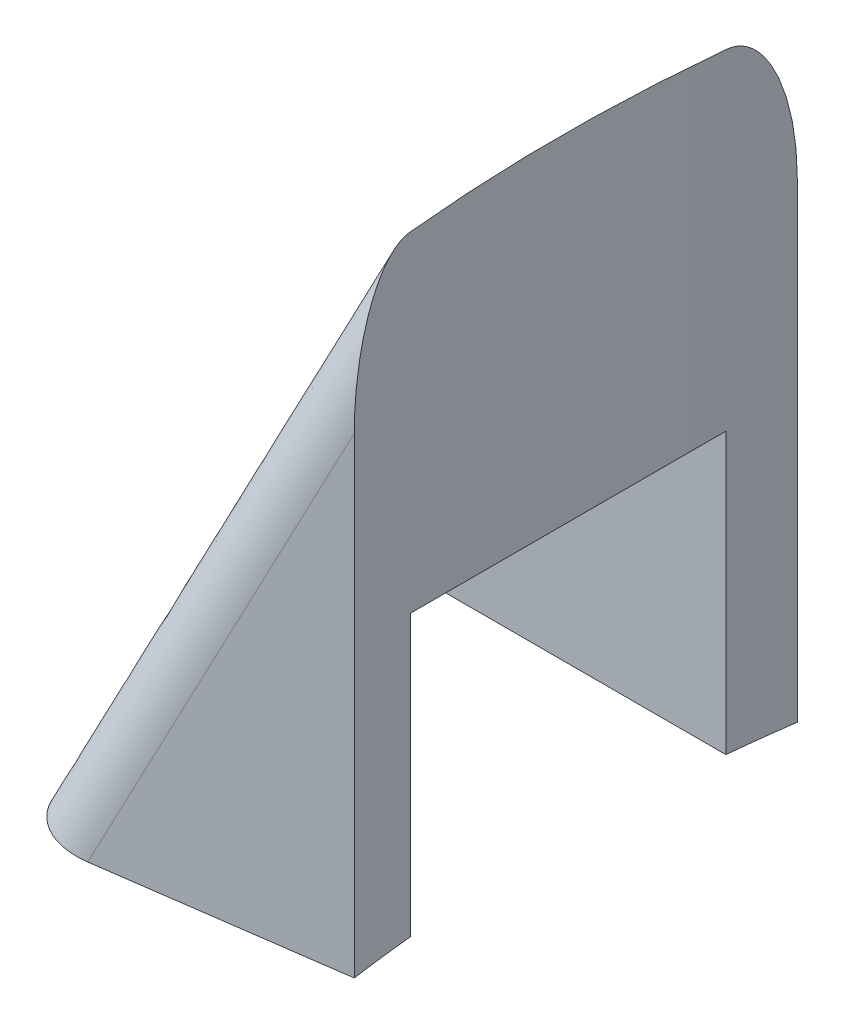
ISO-10303-21;
HEADER;
FILE_DESCRIPTION(('STEP AP214'),'2;1');
FILE_NAME('part.step','',(''),(''),'','','');
FILE_SCHEMA(('AUTOMOTIVE_DESIGN { 1 0 10303 214 1 1 1 1 }'));
ENDSEC;
DATA;
#1=APPLICATION_CONTEXT('core data for automotive mechanical design processes');
#2=APPLICATION_PROTOCOL_DEFINITION('international standard','automotive_design',2000,#1);
#3=PRODUCT_CONTEXT('',#1,'mechanical');
#4=PRODUCT('Part','Part','',(#3));
#5=PRODUCT_RELATED_PRODUCT_CATEGORY('part','',(#4));
#6=PRODUCT_DEFINITION_FORMATION('','',#4);
#7=PRODUCT_DEFINITION_CONTEXT('part definition',#1,'design');
#8=PRODUCT_DEFINITION('design','',#6,#7);
#9=PRODUCT_DEFINITION_SHAPE('','',#8);
#10=(LENGTH_UNIT() NAMED_UNIT(*) SI_UNIT(.MILLI.,.METRE.));
#11=(NAMED_UNIT(*) PLANE_ANGLE_UNIT() SI_UNIT($,.RADIAN.));
#12=(NAMED_UNIT(*) SI_UNIT($,.STERADIAN.) SOLID_ANGLE_UNIT());
#13=UNCERTAINTY_MEASURE_WITH_UNIT(LENGTH_MEASURE(1.E-05),#10,'distance_accuracy_value','');
#14=(GEOMETRIC_REPRESENTATION_CONTEXT(3) GLOBAL_UNCERTAINTY_ASSIGNED_CONTEXT((#13)) GLOBAL_UNIT_ASSIGNED_CONTEXT((#10,
#11,#12)) REPRESENTATION_CONTEXT('',''));
#15=CARTESIAN_POINT('',(0.,0.,0.));
#16=DIRECTION('',(0.,0.,1.));
#17=DIRECTION('',(1.,0.,0.));
#18=AXIS2_PLACEMENT_3D('',#15,#16,#17);
#19=CARTESIAN_POINT('',(0.,60.,0.));
#20=DIRECTION('',(0.,-1.,0.));
#21=DIRECTION('',(1.,0.,0.));
#22=AXIS2_PLACEMENT_3D('',#19,#20,#21);
#23=CONICAL_SURFACE('',#22,156.4,0.463647609000806);
#24=CARTESIAN_POINT('',(0.,0.,0.));
#25=DIRECTION('',(0.,1.,0.));
#26=DIRECTION('',(-1.,0.,0.));
#27=AXIS2_PLACEMENT_3D('',#24,#25,#26);
#28=CIRCLE('',#27,186.4);
#29=CARTESIAN_POINT('',(-185.344352378837,0.,-19.8098723183533));
#30=VERTEX_POINT('',#29);
#31=CARTESIAN_POINT('',(-185.344352378837,0.,19.8098723183533));
#32=VERTEX_POINT('',#31);
#33=EDGE_CURVE('E153',#30,#32,#28,.T.);
#34=ORIENTED_EDGE('',*,*,#33,.T.);
#35=CARTESIAN_POINT('',(-114.632364498512,142.70661885757,9.755102299269));
#36=CARTESIAN_POINT('',(-114.029462463013,142.844664183693,16.0257958352169));
#37=CARTESIAN_POINT('',(-108.450089743653,140.02333728457,15.2416661361223));
#38=CARTESIAN_POINT('',(-119.289973700437,133.311716535217,10.422318340286));
#39=CARTESIAN_POINT('',(-118.67216197689,133.452606155784,16.6782847001696));
#40=CARTESIAN_POINT('',(-113.108765563172,130.628434962212,15.8964003244053));
#41=CARTESIAN_POINT('',(-123.947015799257,123.916481438908,11.0879595435853));
#42=CARTESIAN_POINT('',(-123.320677938584,124.050689790255,17.3315910135534));
#43=CARTESIAN_POINT('',(-117.76678319679,121.233199865905,16.5510420106924));
#44=CARTESIAN_POINT('',(-133.260239153114,105.125499700327,12.4168210809062));
#45=CARTESIAN_POINT('',(-132.617238925096,105.250718088857,18.6381374544596));
#46=CARTESIAN_POINT('',(-127.081806428787,102.442218127331,17.8601831509896));
#47=CARTESIAN_POINT('',(-137.916420408156,95.7297530580564,13.0800414149388));
#48=CARTESIAN_POINT('',(-137.267147589753,95.8488890033988,19.2916394994803));
#49=CARTESIAN_POINT('',(-131.738812027172,93.0464714850653,18.5146826050002));
#50=CARTESIAN_POINT('',(-147.228195430667,76.9379022420714,14.4047900190291));
#51=CARTESIAN_POINT('',(-146.566047606283,77.0490900928585,20.5985146696175));
#52=CARTESIAN_POINT('',(-141.052115519051,74.2546206690796,19.8235820515856));
#53=CARTESIAN_POINT('',(-151.883789198143,67.5417980683605,15.0663182891046));
#54=CARTESIAN_POINT('',(-151.216336014646,67.6484952175082,21.2520700841357));
#55=CARTESIAN_POINT('',(-145.708413412553,64.858516495363,20.4779820441613));
#56=CARTESIAN_POINT('',(-161.194536582301,48.7493180066242,16.3880895618103));
#57=CARTESIAN_POINT('',(-160.516464275944,48.8497202407779,22.5591178728179));
#58=CARTESIAN_POINT('',(-155.020471506104,46.0660364336222,21.7867064614262));
#59=CARTESIAN_POINT('',(-165.849690198982,39.3529421185984,17.0483325644388));
#60=CARTESIAN_POINT('',(-165.16728575477,39.4495542289894,23.2127482055038));
#61=CARTESIAN_POINT('',(-159.676231706153,36.6696605455977,22.4410308861153));
#62=CARTESIAN_POINT('',(-179.81466098894,11.163507501734,19.0276089509326));
#63=CARTESIAN_POINT('',(-179.112316572631,11.2657691925325,25.1725944765966));
#64=CARTESIAN_POINT('',(-173.642904284834,8.48022592873613,24.4039187083381));
#65=CARTESIAN_POINT('',(-189.123988199008,-7.62985837541306,20.3451897271753));
#66=CARTESIAN_POINT('',(-188.416694976641,-7.53671907366697,26.4802395838831));
#67=CARTESIAN_POINT('',(-182.953208738894,-10.3131399484106,25.7123966676451));
#68=CARTESIAN_POINT('',(-203.087383332494,-35.8202892279976,22.3197552836382));
#69=CARTESIAN_POINT('',(-202.37545791575,-35.7428144251435,28.4420157787582));
#70=CARTESIAN_POINT('',(-196.917909359765,-38.5035708009963,27.6750073492714));
#71=CARTESIAN_POINT('',(-207.741749121565,-45.2171632351673,22.9776428713161));
#72=CARTESIAN_POINT('',(-207.027033121767,-45.141782060839,29.0957520408928));
#73=CARTESIAN_POINT('',(-201.572683581533,-47.9004448081666,28.3291932037497));
#74=CARTESIAN_POINT('',(-217.050316237132,-64.011017343805,24.2929165317831));
#75=CARTESIAN_POINT('',(-216.330064415228,-63.9389039246394,30.4032078241383));
#76=CARTESIAN_POINT('',(-210.882021972676,-66.6942989168052,29.637535391768));
#77=CARTESIAN_POINT('',(-221.704517563628,-73.4079974452729,24.9503026045726));
#78=CARTESIAN_POINT('',(-220.981899853559,-73.3378249866923,31.0569806595395));
#79=CARTESIAN_POINT('',(-215.536586142052,-76.0912790182733,30.291691725308));
#80=CARTESIAN_POINT('',(-226.358653719376,-82.8050199915564,25.6074880987639));
#81=CARTESIAN_POINT('',(-225.634806163326,-82.7386817555772,31.7109039961063));
#82=CARTESIAN_POINT('',(-220.191066280633,-85.4883015645561,30.9458362490898));
#83=(BOUNDED_SURFACE() B_SPLINE_SURFACE(3,2,((#35,#36,#37),(#38,#39,#40),(#41,#42,#43),(#44,#45,
#46),(#47,#48,#49),(#50,#51,#52),(#53,#54,#55),(#56,#57,#58),(#59,#60,#61),(#62,#63,#64),(#65,
#66,#67),(#68,#69,#70),(#71,#72,#73),(#74,#75,#76),(#77,#78,#79),(#80,#81,#82)),.UNSPECIFIED.,
.F.,.F.,.F.) B_SPLINE_SURFACE_WITH_KNOTS((4,2,2,2,2,2,2,4),(3,3),(0.,31.520868269444,
63.0417363941229,94.5626041871236,126.083472021928,189.125207035624,220.646074879006,
252.166942700222),(0.,1.),
.UNSPECIFIED.) GEOMETRIC_REPRESENTATION_ITEM() RATIONAL_B_SPLINE_SURFACE(((1.,0.689590740743566,
1.),(1.,0.690346426131703,1.),(1.,0.691011665635995,1.),(1.,0.692203336575749,1.),(1.,
0.692729768011848,1.),(1.,0.693685906515217,1.),(1.,0.694115613583504,1.),(1.,0.694901681346329,
1.),(1.,0.69525804204077,1.),(1.,0.696244382040556,1.),(1.,0.696791619271503,1.),(1.,
0.697509896745316,1.),(1.,0.697732226175399,1.),(1.,0.698148413972608,1.),(1.,0.698342272339754,
1.),(1.,0.69852475604033,1.))) REPRESENTATION_ITEM('') SURFACE());
#84=CARTESIAN_POINT('',(-226.358653719376,-82.8050199915564,25.6074880987639));
#85=CARTESIAN_POINT('',(-221.704517563628,-73.407997445273,24.9503026045726));
#86=CARTESIAN_POINT('',(-217.050316237132,-64.011017343805,24.2929165317831));
#87=CARTESIAN_POINT('',(-207.741749121565,-45.2171632351673,22.9776428713161));
#88=CARTESIAN_POINT('',(-203.087383332494,-35.8202892279976,22.3197552836382));
#89=CARTESIAN_POINT('',(-189.123988199008,-7.62985837541308,20.3451897271753));
#90=CARTESIAN_POINT('',(-179.81466098894,11.163507501734,19.0276089509326));
#91=CARTESIAN_POINT('',(-165.849690198982,39.3529421185984,17.0483325644388));
#92=CARTESIAN_POINT('',(-161.194536582301,48.7493180066242,16.3880895618103));
#93=CARTESIAN_POINT('',(-151.883789198143,67.5417980683605,15.0663182891046));
#94=CARTESIAN_POINT('',(-147.228195430667,76.9379022420714,14.4047900190291));
#95=CARTESIAN_POINT('',(-137.916420408156,95.7297530580564,13.0800414149388));
#96=CARTESIAN_POINT('',(-133.260239153114,105.125499700327,12.4168210809062));
#97=CARTESIAN_POINT('',(-123.947015799257,123.916481438908,11.0879595435853));
#98=CARTESIAN_POINT('',(-119.289973700437,133.311716535217,10.422318340286));
#99=CARTESIAN_POINT('',(-114.632364498512,142.70661885757,9.755102299269));
#100=B_SPLINE_CURVE_WITH_KNOTS('',3,(#84,#85,#86,#87,#88,#89,#90,#91,#92,#93,#94,#95,#96,#97,
#98,#99),.UNSPECIFIED.,.F.,.F.,(4,2,2,2,2,2,2,4),(0.,31.5208678212157,63.0417356645981,
126.083470678294,157.604338513098,189.125206306099,220.646074430778,252.166942700222),.UNSPECIFIED.);
#101=CARTESIAN_POINT('',(-155.620374576695,60.,15.5967630170207));
#102=VERTEX_POINT('',#101);
#103=EDGE_CURVE('E65',#32,#102,#100,.T.);
#104=ORIENTED_EDGE('',*,*,#103,.T.);
#105=CARTESIAN_POINT('',(0.,60.,0.));
#106=DIRECTION('',(0.,1.,0.));
#107=DIRECTION('',(-1.,0.,0.));
#108=AXIS2_PLACEMENT_3D('',#105,#106,#107);
#109=CIRCLE('',#108,156.4);
#110=CARTESIAN_POINT('',(-155.620374576695,60.,-15.5967630170207));
#111=VERTEX_POINT('',#110);
#112=EDGE_CURVE('E149',#111,#102,#109,.T.);
#113=ORIENTED_EDGE('',*,*,#112,.F.);
#114=CARTESIAN_POINT('',(-226.358653719376,-82.8050199915564,-25.6074880987639));
#115=CARTESIAN_POINT('',(-225.634806163326,-82.7386817555772,-31.7109039961063));
#116=CARTESIAN_POINT('',(-220.191066280633,-85.4883015645561,-30.9458362490898));
#117=CARTESIAN_POINT('',(-221.704517563628,-73.407997445273,-24.9503026045726));
#118=CARTESIAN_POINT('',(-220.981899853559,-73.3378249866922,-31.0569806595395));
#119=CARTESIAN_POINT('',(-215.536586142052,-76.0912790182733,-30.291691725308));
#120=CARTESIAN_POINT('',(-217.050316237132,-64.011017343805,-24.2929165317831));
#121=CARTESIAN_POINT('',(-216.330064415228,-63.9389039246394,-30.4032078241383));
#122=CARTESIAN_POINT('',(-210.882021972676,-66.6942989168052,-29.637535391768));
#123=CARTESIAN_POINT('',(-207.741749121565,-45.2171632351673,-22.9776428713161));
#124=CARTESIAN_POINT('',(-207.027033121767,-45.141782060839,-29.0957520408928));
#125=CARTESIAN_POINT('',(-201.572683581533,-47.9004448081666,-28.3291932037497));
#126=CARTESIAN_POINT('',(-203.087383332494,-35.8202892279976,-22.3197552836382));
#127=CARTESIAN_POINT('',(-202.37545791575,-35.7428144251435,-28.4420157787582));
#128=CARTESIAN_POINT('',(-196.917909359765,-38.5035708009963,-27.6750073492714));
#129=CARTESIAN_POINT('',(-189.123988199008,-7.62985837541308,-20.3451897271753));
#130=CARTESIAN_POINT('',(-188.416694976641,-7.53671907366698,-26.4802395838831));
#131=CARTESIAN_POINT('',(-182.953208738894,-10.3131399484106,-25.7123966676451));
#132=CARTESIAN_POINT('',(-179.81466098894,11.163507501734,-19.0276089509326));
#133=CARTESIAN_POINT('',(-179.112316572631,11.2657691925325,-25.1725944765966));
#134=CARTESIAN_POINT('',(-173.642904284834,8.48022592873613,-24.4039187083381));
#135=CARTESIAN_POINT('',(-165.849690198982,39.3529421185984,-17.0483325644388));
#136=CARTESIAN_POINT('',(-165.16728575477,39.4495542289894,-23.2127482055038));
#137=CARTESIAN_POINT('',(-159.676231706153,36.6696605455977,-22.4410308861153));
#138=CARTESIAN_POINT('',(-161.194536582301,48.7493180066242,-16.3880895618103));
#139=CARTESIAN_POINT('',(-160.516464275944,48.8497202407779,-22.5591178728179));
#140=CARTESIAN_POINT('',(-155.020471506104,46.0660364336222,-21.7867064614262));
#141=CARTESIAN_POINT('',(-151.883789198143,67.5417980683605,-15.0663182891046));
#142=CARTESIAN_POINT('',(-151.216336014646,67.6484952175082,-21.2520700841357));
#143=CARTESIAN_POINT('',(-145.708413412553,64.858516495363,-20.4779820441613));
#144=CARTESIAN_POINT('',(-147.228195430667,76.9379022420714,-14.4047900190291));
#145=CARTESIAN_POINT('',(-146.566047606283,77.0490900928585,-20.5985146696175));
#146=CARTESIAN_POINT('',(-141.052115519051,74.2546206690796,-19.8235820515856));
#147=CARTESIAN_POINT('',(-137.916420408156,95.7297530580564,-13.0800414149389));
#148=CARTESIAN_POINT('',(-137.267147589753,95.8488890033988,-19.2916394994803));
#149=CARTESIAN_POINT('',(-131.738812027172,93.0464714850653,-18.5146826050002));
#150=CARTESIAN_POINT('',(-133.260239153114,105.125499700327,-12.4168210809062));
#151=CARTESIAN_POINT('',(-132.617238925096,105.250718088857,-18.6381374544596));
#152=CARTESIAN_POINT('',(-127.081806428788,102.442218127331,-17.8601831509896));
#153=CARTESIAN_POINT('',(-123.947015799257,123.916481438908,-11.0879595435854));
#154=CARTESIAN_POINT('',(-123.320677938584,124.050689790255,-17.3315910135534));
#155=CARTESIAN_POINT('',(-117.76678319679,121.233199865905,-16.5510420106924));
#156=CARTESIAN_POINT('',(-119.289973700437,133.311716535217,-10.422318340286));
#157=CARTESIAN_POINT('',(-118.67216197689,133.452606155784,-16.6782847001696));
#158=CARTESIAN_POINT('',(-113.108765563172,130.628434962212,-15.8964003244053));
#159=CARTESIAN_POINT('',(-114.632364498512,142.70661885757,-9.755102299269));
#160=CARTESIAN_POINT('',(-114.029462463013,142.844664183693,-16.0257958352169));
#161=CARTESIAN_POINT('',(-108.450089743653,140.02333728457,-15.2416661361223));
#162=(BOUNDED_SURFACE() B_SPLINE_SURFACE(3,2,((#114,#115,#116),(#117,#118,#119),(#120,#121,
#122),(#123,#124,#125),(#126,#127,#128),(#129,#130,#131),(#132,#133,#134),(#135,#136,#137),
(#138,#139,#140),(#141,#142,#143),(#144,#145,#146),(#147,#148,#149),(#150,#151,#152),(#153,#154,
#155),(#156,#157,#158),(#159,#160,#161)),.UNSPECIFIED.,.F.,.F.,
.F.) B_SPLINE_SURFACE_WITH_KNOTS((4,2,2,2,2,2,2,4),(3,3),(0.,31.5208678212157,63.0417356645982,
126.083470678294,157.604338513098,189.125206306099,220.646074430778,252.166942700222),(0.,1.),
.UNSPECIFIED.) GEOMETRIC_REPRESENTATION_ITEM() RATIONAL_B_SPLINE_SURFACE(((1.,0.69852475604033,
1.),(1.,0.698342272339754,1.),(1.,0.698148413972608,1.),(1.,0.697732226175399,1.),(1.,
0.697509896745316,1.),(1.,0.696791619271503,1.),(1.,0.696244382040555,1.),(1.,0.69525804204077,
1.),(1.,0.694901681346329,1.),(1.,0.694115613583505,1.),(1.,0.693685906515217,1.),(1.,
0.692729768011848,1.),(1.,0.692203336575749,1.),(1.,0.691011665635995,1.),(1.,0.690346426131703,
1.),(1.,0.689590740743566,1.))) REPRESENTATION_ITEM('') SURFACE());
#163=CARTESIAN_POINT('',(-114.632364498512,142.70661885757,-9.755102299269));
#164=CARTESIAN_POINT('',(-119.289973700437,133.311716535217,-10.422318340286));
#165=CARTESIAN_POINT('',(-123.947015799257,123.916481438908,-11.0879595435853));
#166=CARTESIAN_POINT('',(-133.260239153114,105.125499700327,-12.4168210809062));
#167=CARTESIAN_POINT('',(-137.916420408156,95.7297530580564,-13.0800414149389));
#168=CARTESIAN_POINT('',(-147.228195430667,76.9379022420714,-14.4047900190291));
#169=CARTESIAN_POINT('',(-151.883789198143,67.5417980683605,-15.0663182891046));
#170=CARTESIAN_POINT('',(-161.194536582301,48.7493180066242,-16.3880895618103));
#171=CARTESIAN_POINT('',(-165.849690198982,39.3529421185984,-17.0483325644388));
#172=CARTESIAN_POINT('',(-179.81466098894,11.163507501734,-19.0276089509326));
#173=CARTESIAN_POINT('',(-189.123988199008,-7.62985837541308,-20.3451897271753));
#174=CARTESIAN_POINT('',(-203.087383332494,-35.8202892279976,-22.3197552836382));
#175=CARTESIAN_POINT('',(-207.741749121565,-45.2171632351673,-22.9776428713161));
#176=CARTESIAN_POINT('',(-217.050316237132,-64.011017343805,-24.2929165317831));
#177=CARTESIAN_POINT('',(-221.704517563628,-73.407997445273,-24.9503026045726));
#178=CARTESIAN_POINT('',(-226.358653719376,-82.8050199915564,-25.6074880987639));
#179=B_SPLINE_CURVE_WITH_KNOTS('',3,(#163,#164,#165,#166,#167,#168,#169,#170,#171,#172,#173,
#174,#175,#176,#177,#178),.UNSPECIFIED.,.F.,.F.,(4,2,2,2,2,2,2,4),(0.,31.5208682694441,
63.0417363941229,94.5626041871236,126.083472021928,189.125207035624,220.646074879006,
252.166942700222),.UNSPECIFIED.);
#180=EDGE_CURVE('E238',#111,#30,#179,.T.);
#181=ORIENTED_EDGE('',*,*,#180,.T.);
#182=EDGE_LOOP('',(#34,#104,#113,#181));
#183=FACE_BOUND('',#182,.T.);
#184=ADVANCED_FACE('F38',(#183),#23,.T.);
#185=CARTESIAN_POINT('',(-184.585968013429,0.,-25.9418660189563));
#186=DIRECTION('',(0.,-1.,0.));
#187=DIRECTION('',(1.,0.,0.));
#188=AXIS2_PLACEMENT_3D('',#185,#186,#187);
#189=PLANE('',#188);
#190=DIRECTION('',(0.99026806874157,0.,-0.139173100960066));
#191=VECTOR('',#190,1.);
#192=CARTESIAN_POINT('',(-184.585968013429,0.,25.9418660189563));
#193=LINE('',#192,#191);
#194=CARTESIAN_POINT('',(-177.843823540054,0.,24.9943194069841));
#195=VERTEX_POINT('',#194);
#196=CARTESIAN_POINT('',(-154.877925951182,0.,21.7666729901543));
#197=VERTEX_POINT('',#196);
#198=EDGE_CURVE('E129',#195,#197,#193,.T.);
#199=ORIENTED_EDGE('',*,*,#198,.F.);
#200=CARTESIAN_POINT('',(-177.843823540054,0.,24.9943194069841));
#201=CARTESIAN_POINT('',(-178.048004830635,0.,25.0230211476792));
#202=CARTESIAN_POINT('',(-178.253376299629,0.,25.0432943394174));
#203=CARTESIAN_POINT('',(-178.665129441646,0.,25.0668274461386));
#204=CARTESIAN_POINT('',(-178.871511297604,0.,25.0700841568888));
#205=CARTESIAN_POINT('',(-179.284476257102,0.,25.0594006591258));
#206=CARTESIAN_POINT('',(-179.491058000942,0.,25.0454071050883));
#207=CARTESIAN_POINT('',(-179.902293174687,0.,25.0000135381139));
#208=CARTESIAN_POINT('',(-180.106946730846,0.,24.9686146730191));
#209=CARTESIAN_POINT('',(-180.513228735104,0.,24.8882576184924));
#210=CARTESIAN_POINT('',(-180.71485003327,0.,24.8392631661245));
#211=CARTESIAN_POINT('',(-181.112901546847,0.,24.7237406730884));
#212=CARTESIAN_POINT('',(-181.3093344922,0.,24.6572220637576));
#213=CARTESIAN_POINT('',(-181.695250390679,0.,24.5067835727408));
#214=CARTESIAN_POINT('',(-181.884738892325,0.,24.4228779562349));
#215=CARTESIAN_POINT('',(-182.2551110063,0.,24.2378328776925));
#216=CARTESIAN_POINT('',(-182.435995368946,0.,24.1366949219241));
#217=CARTESIAN_POINT('',(-182.776070354243,0.,23.9245435819603));
#218=CARTESIAN_POINT('',(-182.935908931559,0.,23.8145690387462));
#219=CARTESIAN_POINT('',(-183.244727003544,0.,23.5803105985852));
#220=CARTESIAN_POINT('',(-183.393707907603,0.,23.4560285642567));
#221=CARTESIAN_POINT('',(-183.679130691095,0.,23.1938376108741));
#222=CARTESIAN_POINT('',(-183.815574542791,0.,23.0559308423007));
#223=CARTESIAN_POINT('',(-184.074245477545,0.,22.767377693874));
#224=CARTESIAN_POINT('',(-184.196474831913,0.,22.6167333559976));
#225=CARTESIAN_POINT('',(-184.412352203905,0.,22.3213238956068));
#226=CARTESIAN_POINT('',(-184.507667401049,0.,22.1777749704651));
#227=CARTESIAN_POINT('',(-184.684712462078,0.,21.8825410932719));
#228=CARTESIAN_POINT('',(-184.766444411131,0.,21.7308573947284));
#229=CARTESIAN_POINT('',(-184.915250792555,0.,21.4207702317995));
#230=CARTESIAN_POINT('',(-184.982349398297,0.,21.2623783739077));
#231=CARTESIAN_POINT('',(-185.101217827414,0.,20.9400200926927));
#232=CARTESIAN_POINT('',(-185.152995788122,0.,20.7760566803987));
#233=CARTESIAN_POINT('',(-185.231496705762,0.,20.4786709108061));
#234=CARTESIAN_POINT('',(-185.261194283267,0.,20.34602575511));
#235=CARTESIAN_POINT('',(-185.310417488198,0.,20.0790651292093));
#236=CARTESIAN_POINT('',(-185.329958108948,0.,19.9447524224112));
#237=CARTESIAN_POINT('',(-185.344352378837,0.,19.8098723183533));
#238=B_SPLINE_CURVE_WITH_KNOTS('',3,(#200,#201,#202,#203,#204,#205,#206,#207,#208,#209,#210,
#211,#212,#213,#214,#215,#216,#217,#218,#219,#220,#221,#222,#223,#224,#225,#226,#227,#228,#229,
#230,#231,#232,#233,#234,#235,#236,#237),.UNSPECIFIED.,.F.,.F.,(4,2,2,2,2,2,2,2,2,2,2,2,2,2,2,2,
2,2,4),(0.,0.61840019377349,1.23691682917935,1.85735100185841,2.47774426312769,3.09942350665081,
3.72076884931174,4.34160641301427,4.96238973750488,5.5436458114506,6.12482630006056,
6.70591520327117,7.28691112731532,7.80314945216627,8.31930845583039,8.83460822749416,
9.3496338119771,9.75704350342265,10.1638500714817),.UNSPECIFIED.);
#239=EDGE_CURVE('E241',#195,#32,#238,.T.);
#240=ORIENTED_EDGE('',*,*,#239,.T.);
#241=ORIENTED_EDGE('',*,*,#33,.F.);
#242=CARTESIAN_POINT('',(-185.344352378837,0.,-19.8098723183533));
#243=CARTESIAN_POINT('',(-185.327889842889,0.,-19.9642089723793));
#244=CARTESIAN_POINT('',(-185.304675289326,0.,-20.1178167923397));
#245=CARTESIAN_POINT('',(-185.245058491854,0.,-20.4224152337068));
#246=CARTESIAN_POINT('',(-185.208659362755,0.,-20.5734064644525));
#247=CARTESIAN_POINT('',(-185.123126355587,0.,-20.8711825022602));
#248=CARTESIAN_POINT('',(-185.074035896619,0.,-21.0179797921856));
#249=CARTESIAN_POINT('',(-184.96353992391,0.,-21.3068629207485));
#250=CARTESIAN_POINT('',(-184.902134134332,0.,-21.4489486537745));
#251=CARTESIAN_POINT('',(-184.767661703432,0.,-21.7273688272922));
#252=CARTESIAN_POINT('',(-184.694602775163,0.,-21.8637069970737));
#253=CARTESIAN_POINT('',(-184.537450954323,0.,-22.129929319818));
#254=CARTESIAN_POINT('',(-184.453353962392,0.,-22.2598110501321));
#255=CARTESIAN_POINT('',(-184.274911993502,0.,-22.5123521463636));
#256=CARTESIAN_POINT('',(-184.180565590691,0.,-22.6350105037275));
#257=CARTESIAN_POINT('',(-183.982415644084,0.,-22.8724999175942));
#258=CARTESIAN_POINT('',(-183.878608494141,0.,-22.9873279600182));
#259=CARTESIAN_POINT('',(-183.658343765606,0.,-23.2127696125563));
#260=CARTESIAN_POINT('',(-183.541557116583,0.,-23.3230619620934));
#261=CARTESIAN_POINT('',(-183.299689419542,0.,-23.5341716745124));
#262=CARTESIAN_POINT('',(-183.174605380594,0.,-23.6349855887326));
#263=CARTESIAN_POINT('',(-182.788399327846,0.,-23.9225720114846));
#264=CARTESIAN_POINT('',(-182.516148865188,0.,-24.0946661273968));
#265=CARTESIAN_POINT('',(-181.922098871727,0.,-24.4122698141318));
#266=CARTESIAN_POINT('',(-181.598056901538,0.,-24.5535427841804));
#267=CARTESIAN_POINT('',(-180.93195331002,0.,-24.7855057969487));
#268=CARTESIAN_POINT('',(-180.589873064467,0.,-24.8761423932816));
#269=CARTESIAN_POINT('',(-180.045683191522,0.,-24.9784859898868));
#270=CARTESIAN_POINT('',(-179.846618980565,0.,-25.0073738948498));
#271=CARTESIAN_POINT('',(-179.4467194888,0.,-25.0487392104554));
#272=CARTESIAN_POINT('',(-179.245883904269,0.,-25.061213749522));
#273=CARTESIAN_POINT('',(-178.844150229944,0.,-25.0698337201253));
#274=CARTESIAN_POINT('',(-178.643252590912,0.,-25.0660011828808));
#275=CARTESIAN_POINT('',(-178.242470608515,0.,-25.0422107278912));
#276=CARTESIAN_POINT('',(-178.042585993872,0.,-25.0222573847588));
#277=CARTESIAN_POINT('',(-177.843823540054,0.,-24.9943194069841));
#278=B_SPLINE_CURVE_WITH_KNOTS('',3,(#242,#243,#244,#245,#246,#247,#248,#249,#250,#251,#252,
#253,#254,#255,#256,#257,#258,#259,#260,#261,#262,#263,#264,#265,#266,#267,#268,#269,#270,#271,
#272,#273,#274,#275,#276,#277),.UNSPECIFIED.,.F.,.F.,(4,2,2,2,2,2,2,2,2,2,2,2,2,2,2,2,2,4),(0.,
0.465477745722362,0.930845595625844,1.39464194297361,1.85844867949428,2.32194969292978,
2.78562333288852,3.24936155989201,3.7132772950132,4.19465281473751,4.67620280718212,
5.638565230154,6.69489615055107,7.75233992552453,8.3552053378604,8.95817620960063,
9.56033271327881,10.1623184025653),.UNSPECIFIED.);
#279=CARTESIAN_POINT('',(-177.843823540054,0.,-24.9943194069841));
#280=VERTEX_POINT('',#279);
#281=EDGE_CURVE('E170',#30,#280,#278,.T.);
#282=ORIENTED_EDGE('',*,*,#281,.T.);
#283=DIRECTION('',(0.99026806874157,0.,0.139173100960066));
#284=VECTOR('',#283,1.);
#285=CARTESIAN_POINT('',(-184.585968013429,0.,-25.9418660189563));
#286=LINE('',#285,#284);
#287=CARTESIAN_POINT('',(-154.877925951182,0.,-21.7666729901543));
#288=VERTEX_POINT('',#287);
#289=EDGE_CURVE('E145',#280,#288,#286,.T.);
#290=ORIENTED_EDGE('',*,*,#289,.T.);
#291=CARTESIAN_POINT('',(0.,0.,0.));
#292=DIRECTION('',(0.,1.,0.));
#293=DIRECTION('',(-1.,0.,0.));
#294=AXIS2_PLACEMENT_3D('',#291,#292,#293);
#295=CIRCLE('',#294,156.4);
#296=CARTESIAN_POINT('',(-155.630042086996,0.,-15.5));
#297=VERTEX_POINT('',#296);
#298=EDGE_CURVE('E136',#288,#297,#295,.T.);
#299=ORIENTED_EDGE('',*,*,#298,.T.);
#300=DIRECTION('',(1.,0.,0.));
#301=VECTOR('',#300,1.);
#302=CARTESIAN_POINT('',(-183.162197198644,0.,-15.5));
#303=LINE('',#302,#301);
#304=CARTESIAN_POINT('',(-183.162197198644,0.,-15.5));
#305=VERTEX_POINT('',#304);
#306=EDGE_CURVE('E114',#305,#297,#303,.T.);
#307=ORIENTED_EDGE('',*,*,#306,.F.);
#308=DIRECTION('',(0.,0.,-1.));
#309=VECTOR('',#308,1.);
#310=CARTESIAN_POINT('',(-183.162197198644,0.,15.5));
#311=LINE('',#310,#309);
#312=CARTESIAN_POINT('',(-183.162197198644,0.,15.5));
#313=VERTEX_POINT('',#312);
#314=EDGE_CURVE('E121',#313,#305,#311,.T.);
#315=ORIENTED_EDGE('',*,*,#314,.F.);
#316=DIRECTION('',(1.,0.,0.));
#317=VECTOR('',#316,1.);
#318=CARTESIAN_POINT('',(-183.162197198644,0.,15.5));
#319=LINE('',#318,#317);
#320=CARTESIAN_POINT('',(-155.630042086996,0.,15.5));
#321=VERTEX_POINT('',#320);
#322=EDGE_CURVE('E130',#313,#321,#319,.T.);
#323=ORIENTED_EDGE('',*,*,#322,.T.);
#324=EDGE_CURVE('E151',#321,#197,#295,.T.);
#325=ORIENTED_EDGE('',*,*,#324,.T.);
#326=EDGE_LOOP('',(#199,#240,#241,#282,#290,#299,#307,#315,#323,#325));
#327=FACE_BOUND('',#326,.T.);
#328=ADVANCED_FACE('F134',(#327),#189,.T.);
#329=CARTESIAN_POINT('',(0.,70.,0.));
#330=DIRECTION('',(0.,1.,0.));
#331=DIRECTION('',(-1.,0.,0.));
#332=AXIS2_PLACEMENT_3D('',#329,#330,#331);
#333=CYLINDRICAL_SURFACE('',#332,156.4);
#334=ORIENTED_EDGE('',*,*,#112,.T.);
#335=CARTESIAN_POINT('',(-155.620374576695,60.,15.5967630170207));
#336=CARTESIAN_POINT('',(-155.611803381851,60.0000359014625,15.6822919497781));
#337=CARTESIAN_POINT('',(-155.603162568262,59.996013756026,15.7677895187336));
#338=CARTESIAN_POINT('',(-155.58582481174,59.9801718913298,15.9379533928361));
#339=CARTESIAN_POINT('',(-155.577127947911,59.9683614643528,16.0226205667147));
#340=CARTESIAN_POINT('',(-155.559837372439,59.937433550299,16.1896257344289));
#341=CARTESIAN_POINT('',(-155.551243591868,59.9183990055505,16.2719791726052));
#342=CARTESIAN_POINT('',(-155.534122953613,59.8735244489435,16.4348201399802));
#343=CARTESIAN_POINT('',(-155.525596120448,59.847682053428,16.5153070048685));
#344=CARTESIAN_POINT('',(-155.495935331979,59.746186772358,16.7932687711813));
#345=CARTESIAN_POINT('',(-155.475100773947,59.6540163515423,16.9848932468285));
#346=CARTESIAN_POINT('',(-155.434633965732,59.4398102653601,17.3513390363153));
#347=CARTESIAN_POINT('',(-155.415008080541,59.3176310202614,17.526073766466));
#348=CARTESIAN_POINT('',(-155.381002942457,59.0785709813142,17.8247492986395));
#349=CARTESIAN_POINT('',(-155.366362857705,58.9655751996275,17.9518340684418));
#350=CARTESIAN_POINT('',(-155.337983277274,58.7288513278767,18.1957701795674));
#351=CARTESIAN_POINT('',(-155.324244359999,58.6051164611542,18.3126149643466));
#352=CARTESIAN_POINT('',(-155.297631478829,58.3492159791367,18.5369474532332));
#353=CARTESIAN_POINT('',(-155.284758325802,58.2170426802035,18.644426412493));
#354=CARTESIAN_POINT('',(-155.25983807709,57.946055603961,18.8508218860697));
#355=CARTESIAN_POINT('',(-155.247791303421,57.8072392734292,18.9497350664544));
#356=CARTESIAN_POINT('',(-155.224879714866,57.5291821997285,19.1364902867167));
#357=CARTESIAN_POINT('',(-155.213988520067,57.390119655984,19.2245958366507));
#358=CARTESIAN_POINT('',(-155.192890996738,57.1079418784427,19.3941709566492));
#359=CARTESIAN_POINT('',(-155.182684801027,56.964825866307,19.4756392404363));
#360=CARTESIAN_POINT('',(-155.153022124173,56.5302999601556,19.711034504963));
#361=CARTESIAN_POINT('',(-155.134533924126,56.2338650922257,19.8558516249973));
#362=CARTESIAN_POINT('',(-155.099788637162,55.630095751637,20.1254578149686));
#363=CARTESIAN_POINT('',(-155.083544408377,55.3227102113016,20.2501321035235));
#364=CARTESIAN_POINT('',(-155.053199589723,54.7011935794631,20.4811829055221));
#365=CARTESIAN_POINT('',(-155.0390982933,54.3870647504692,20.5875654515268));
#366=CARTESIAN_POINT('',(-155.012921304383,53.7549373001768,20.7837427668177));
#367=CARTESIAN_POINT('',(-155.000838130597,53.4369578797463,20.8735989316669));
#368=CARTESIAN_POINT('',(-154.978506355386,52.7971403044817,21.0387619188291));
#369=CARTESIAN_POINT('',(-154.968258087398,52.4753014596344,21.1140660969782));
#370=CARTESIAN_POINT('',(-154.949491233555,51.8283462992457,21.2513520624508));
#371=CARTESIAN_POINT('',(-154.940974797183,51.5032264301652,21.3133172995051));
#372=CARTESIAN_POINT('',(-154.925612922384,50.8508018574968,21.424696400713));
#373=CARTESIAN_POINT('',(-154.918767551586,50.5234970660337,21.4741097568838));
#374=CARTESIAN_POINT('',(-154.906864432776,49.8766578652491,21.5598043954371));
#375=CARTESIAN_POINT('',(-154.901761233332,49.5571683553278,21.5964202808299));
#376=CARTESIAN_POINT('',(-154.893041366224,48.9171128464312,21.6588716765505));
#377=CARTESIAN_POINT('',(-154.889424737135,48.5965468197391,21.6847069071323));
#378=CARTESIAN_POINT('',(-154.88366036984,47.9557158209712,21.7258418473637));
#379=CARTESIAN_POINT('',(-154.881508166804,47.6354529337854,21.7411735816816));
#380=CARTESIAN_POINT('',(-154.878641938726,46.99462429913,21.7615781326484));
#381=CARTESIAN_POINT('',(-154.877927774286,46.6740585840292,21.7666519436526));
#382=CARTESIAN_POINT('',(-154.877925951182,46.3534977351177,21.7666729901543));
#383=B_SPLINE_CURVE_WITH_KNOTS('',3,(#335,#336,#337,#338,#339,#340,#341,#342,#343,#344,#345,
#346,#347,#348,#349,#350,#351,#352,#353,#354,#355,#356,#357,#358,#359,#360,#361,#362,#363,#364,
#365,#366,#367,#368,#369,#370,#371,#372,#373,#374,#375,#376,#377,#378,#379,#380,#381,#382),
.UNSPECIFIED.,.F.,.F.,(4,2,2,2,2,2,2,2,2,2,2,2,2,2,2,2,2,2,2,2,2,2,2,4),(0.,0.257739175498217,
0.515171394631617,0.769733234103298,1.02438432294873,1.66149638451042,2.30171826386873,
2.81305354722184,3.32471387642079,3.83684693410886,4.34917843423715,4.84392017856704,
5.33875757505627,6.32898023508494,7.32466040325071,8.32001156665343,9.31158681841135,
10.3033420749546,11.2963208468494,12.2893397988276,13.2540119839375,14.2187091996476,
15.1804518496231,16.1421012682697),.UNSPECIFIED.);
#384=CARTESIAN_POINT('',(-154.877925951182,46.3534977351177,21.7666729901543));
#385=VERTEX_POINT('',#384);
#386=EDGE_CURVE('E51',#102,#385,#383,.T.);
#387=ORIENTED_EDGE('',*,*,#386,.T.);
#388=DIRECTION('',(0.,1.,0.));
#389=VECTOR('',#388,1.);
#390=CARTESIAN_POINT('',(-154.877925951182,0.,21.7666729901543));
#391=LINE('',#390,#389);
#392=EDGE_CURVE('E142',#197,#385,#391,.T.);
#393=ORIENTED_EDGE('',*,*,#392,.F.);
#394=ORIENTED_EDGE('',*,*,#324,.F.);
#395=DIRECTION('',(0.,1.,0.));
#396=VECTOR('',#395,1.);
#397=CARTESIAN_POINT('',(-155.630042086996,70.,15.5));
#398=LINE('',#397,#396);
#399=CARTESIAN_POINT('',(-155.630042086996,27.5321551116478,15.5));
#400=VERTEX_POINT('',#399);
#401=EDGE_CURVE('E159',#400,#321,#398,.F.);
#402=ORIENTED_EDGE('',*,*,#401,.F.);
#403=CARTESIAN_POINT('',(0.,183.162197198642,0.));
#404=DIRECTION('',(0.707106781186544,-0.707106781186551,0.));
#405=DIRECTION('',(0.707106781186551,0.707106781186544,0.));
#406=AXIS2_PLACEMENT_3D('',#403,#404,#405);
#407=ELLIPSE('',#406,221.183001155151,156.4);
#408=CARTESIAN_POINT('',(-155.630042086996,27.5321551116478,-15.5));
#409=VERTEX_POINT('',#408);
#410=EDGE_CURVE('E157',#400,#409,#407,.T.);
#411=ORIENTED_EDGE('',*,*,#410,.T.);
#412=DIRECTION('',(0.,1.,0.));
#413=VECTOR('',#412,1.);
#414=CARTESIAN_POINT('',(-155.630042086996,70.,-15.5));
#415=LINE('',#414,#413);
#416=EDGE_CURVE('E116',#409,#297,#415,.F.);
#417=ORIENTED_EDGE('',*,*,#416,.T.);
#418=ORIENTED_EDGE('',*,*,#298,.F.);
#419=DIRECTION('',(0.,1.,0.));
#420=VECTOR('',#419,1.);
#421=CARTESIAN_POINT('',(-154.877925951182,0.,-21.7666729901543));
#422=LINE('',#421,#420);
#423=CARTESIAN_POINT('',(-154.877925951182,46.3534977351177,-21.7666729901543));
#424=VERTEX_POINT('',#423);
#425=EDGE_CURVE('E147',#288,#424,#422,.T.);
#426=ORIENTED_EDGE('',*,*,#425,.T.);
#427=CARTESIAN_POINT('',(-154.877925951182,46.3534977351177,-21.7666729901543));
#428=CARTESIAN_POINT('',(-154.877929688629,46.7365490614599,-21.7666297418382));
#429=CARTESIAN_POINT('',(-154.878948365142,47.1196123066998,-21.7593973882737));
#430=CARTESIAN_POINT('',(-154.883042814172,47.8852558574203,-21.730243000849));
#431=CARTESIAN_POINT('',(-154.886119067175,48.2678360291812,-21.7083175358393));
#432=CARTESIAN_POINT('',(-154.894386836776,49.0346956446843,-21.6492442179659));
#433=CARTESIAN_POINT('',(-154.899594064003,49.4189662753303,-21.6119832923553));
#434=CARTESIAN_POINT('',(-154.912179744434,50.1855802460006,-21.5215861141366));
#435=CARTESIAN_POINT('',(-154.919558022303,50.5679237391259,-21.4684511435174));
#436=CARTESIAN_POINT('',(-154.936682576408,51.3350521388666,-21.34451608577));
#437=CARTESIAN_POINT('',(-154.946459744734,51.7197993392833,-21.2734851917588));
#438=CARTESIAN_POINT('',(-154.968448240572,52.4854087177672,-21.1127131335221));
#439=CARTESIAN_POINT('',(-154.980660042995,52.8662701225927,-21.0229683187155));
#440=CARTESIAN_POINT('',(-155.007634602232,53.6212837741901,-20.8231447979101));
#441=CARTESIAN_POINT('',(-155.02238924249,53.9954533098189,-20.7131307150736));
#442=CARTESIAN_POINT('',(-155.054684561366,54.7359891944308,-20.469976274761));
#443=CARTESIAN_POINT('',(-155.072223652886,55.1023598545622,-20.3368490874128));
#444=CARTESIAN_POINT('',(-155.100014337352,55.6279622081554,-20.1233706069477));
#445=CARTESIAN_POINT('',(-155.109048999234,55.7916032029954,-20.0536351792593));
#446=CARTESIAN_POINT('',(-155.127798130604,56.1161442858095,-19.9080800374511));
#447=CARTESIAN_POINT('',(-155.137512639982,56.2770442122563,-19.8322599662649));
#448=CARTESIAN_POINT('',(-155.157662888242,56.5955758440174,-19.6739932591143));
#449=CARTESIAN_POINT('',(-155.168098841163,56.7532065612243,-19.5915446553841));
#450=CARTESIAN_POINT('',(-155.189734400132,57.0644288506441,-19.4194197749577));
#451=CARTESIAN_POINT('',(-155.200933982213,57.2180205494072,-19.3297437250703));
#452=CARTESIAN_POINT('',(-155.224247608082,57.5215379949245,-19.1416305078026));
#453=CARTESIAN_POINT('',(-155.236368692818,57.6714208120123,-19.0431245782412));
#454=CARTESIAN_POINT('',(-155.261498841327,57.9648994230078,-18.8371375216214));
#455=CARTESIAN_POINT('',(-155.274508105288,58.1084937874887,-18.7296543699291));
#456=CARTESIAN_POINT('',(-155.301442542427,58.3873692260861,-18.5049918523432));
#457=CARTESIAN_POINT('',(-155.315365766829,58.5226668703337,-18.3878329878305));
#458=CARTESIAN_POINT('',(-155.344192062934,58.7828662332714,-18.1426902638469));
#459=CARTESIAN_POINT('',(-155.359094437892,58.9077752039471,-18.0147140835717));
#460=CARTESIAN_POINT('',(-155.391742219451,59.1582119243244,-17.7310238023199));
#461=CARTESIAN_POINT('',(-155.409615343703,59.2820624233262,-17.5738195263776));
#462=CARTESIAN_POINT('',(-155.446576615484,59.5069981131609,-17.2438185435329));
#463=CARTESIAN_POINT('',(-155.465663925964,59.6080987739527,-17.0710325449243));
#464=CARTESIAN_POINT('',(-155.501937814779,59.7674103967092,-16.7371227579724));
#465=CARTESIAN_POINT('',(-155.518996425288,59.8297231076576,-16.5779647039735));
#466=CARTESIAN_POINT('',(-155.553433994981,59.9269651309284,-16.2516413482718));
#467=CARTESIAN_POINT('',(-155.570811971715,59.9619674746939,-16.0844986791001));
#468=CARTESIAN_POINT('',(-155.593488703754,59.9876651122381,-15.8628227991714));
#469=CARTESIAN_POINT('',(-155.598893565078,59.9922823726792,-15.8097183313941));
#470=CARTESIAN_POINT('',(-155.609665506329,59.9984482372273,-15.7033386562171));
#471=CARTESIAN_POINT('',(-155.615032593585,59.9999974538594,-15.6500634850256));
#472=CARTESIAN_POINT('',(-155.620374576695,60.,-15.5967630170207));
#473=B_SPLINE_CURVE_WITH_KNOTS('',3,(#427,#428,#429,#430,#431,#432,#433,#434,#435,#436,#437,
#438,#439,#440,#441,#442,#443,#444,#445,#446,#447,#448,#449,#450,#451,#452,#453,#454,#455,#456,
#457,#458,#459,#460,#461,#462,#463,#464,#465,#466,#467,#468,#469,#470,#471,#472),.UNSPECIFIED.,
.F.,.F.,(4,2,2,2,2,2,2,2,2,2,2,2,2,2,2,2,2,2,2,2,2,2,4),(0.,1.14910351476427,2.29847546283326,
3.45647836170438,4.61438776545444,5.78807251957058,6.96198644246995,8.1322204608774,
9.30178984118461,9.8360186707878,10.3702788736009,10.9046982683091,11.4391008986107,
11.9781030201723,12.5172270328968,13.0552366717355,13.5928675354652,14.1941440577216,
14.7950104661594,15.3083782972443,15.8203685661556,15.9810363248543,16.1416720035236),.UNSPECIFIED.);
#474=EDGE_CURVE('E242',#424,#111,#473,.T.);
#475=ORIENTED_EDGE('',*,*,#474,.T.);
#476=EDGE_LOOP('',(#334,#387,#393,#394,#402,#411,#417,#418,#426,#475));
#477=FACE_BOUND('',#476,.T.);
#478=ADVANCED_FACE('F223',(#477),#333,.F.);
#479=CARTESIAN_POINT('',(0.,0.,0.));
#480=DIRECTION('',(-0.139173100960066,0.,0.99026806874157));
#481=DIRECTION('',(0.99026806874157,0.,0.139173100960066));
#482=AXIS2_PLACEMENT_3D('',#479,#480,#481);
#483=PLANE('',#482);
#484=ORIENTED_EDGE('',*,*,#289,.F.);
#485=CARTESIAN_POINT('',(-220.191066280633,-85.4883015645561,-30.9458362490898));
#486=CARTESIAN_POINT('',(-215.536586142052,-76.0912790182733,-30.291691725308));
#487=CARTESIAN_POINT('',(-210.882021972676,-66.6942989168052,-29.637535391768));
#488=CARTESIAN_POINT('',(-201.572683581533,-47.9004448081666,-28.3291932037497));
#489=CARTESIAN_POINT('',(-196.917909359765,-38.5035708009963,-27.6750073492714));
#490=CARTESIAN_POINT('',(-182.953208738894,-10.3131399484106,-25.7123966676451));
#491=CARTESIAN_POINT('',(-173.642904284834,8.48022592873612,-24.4039187083381));
#492=CARTESIAN_POINT('',(-159.676231706153,36.6696605455977,-22.4410308861153));
#493=CARTESIAN_POINT('',(-155.020471506104,46.0660364336222,-21.7867064614262));
#494=CARTESIAN_POINT('',(-145.708413412553,64.858516495363,-20.4779820441613));
#495=CARTESIAN_POINT('',(-141.052115519051,74.2546206690796,-19.8235820515856));
#496=CARTESIAN_POINT('',(-131.738812027172,93.0464714850653,-18.5146826050002));
#497=CARTESIAN_POINT('',(-127.081806428788,102.442218127331,-17.8601831509896));
#498=CARTESIAN_POINT('',(-117.76678319679,121.233199865905,-16.5510420106924));
#499=CARTESIAN_POINT('',(-113.108765563172,130.628434962212,-15.8964003244053));
#500=CARTESIAN_POINT('',(-108.450089743653,140.02333728457,-15.2416661361223));
#501=B_SPLINE_CURVE_WITH_KNOTS('',3,(#485,#486,#487,#488,#489,#490,#491,#492,#493,#494,#495,
#496,#497,#498,#499,#500),.UNSPECIFIED.,.F.,.F.,(4,2,2,2,2,2,2,4),(0.,31.5208678212157,
63.0417356645982,126.083470678294,157.604338513098,189.125206306099,220.646074430778,
252.166942700222),.UNSPECIFIED.);
#502=EDGE_CURVE('E11',#280,#424,#501,.T.);
#503=ORIENTED_EDGE('',*,*,#502,.T.);
#504=ORIENTED_EDGE('',*,*,#425,.F.);
#505=EDGE_LOOP('',(#484,#503,#504));
#506=FACE_BOUND('',#505,.T.);
#507=ADVANCED_FACE('F220',(#506),#483,.F.);
#508=CARTESIAN_POINT('',(0.,0.,0.));
#509=DIRECTION('',(0.139173100960066,0.,0.99026806874157));
#510=DIRECTION('',(0.99026806874157,0.,-0.139173100960066));
#511=AXIS2_PLACEMENT_3D('',#508,#509,#510);
#512=PLANE('',#511);
#513=ORIENTED_EDGE('',*,*,#392,.T.);
#514=CARTESIAN_POINT('',(-108.450089743653,140.02333728457,15.2416661361223));
#515=CARTESIAN_POINT('',(-113.108765563172,130.628434962212,15.8964003244053));
#516=CARTESIAN_POINT('',(-117.76678319679,121.233199865905,16.5510420106924));
#517=CARTESIAN_POINT('',(-127.081806428787,102.442218127331,17.8601831509896));
#518=CARTESIAN_POINT('',(-131.738812027172,93.0464714850653,18.5146826050002));
#519=CARTESIAN_POINT('',(-141.052115519051,74.2546206690796,19.8235820515856));
#520=CARTESIAN_POINT('',(-145.708413412553,64.858516495363,20.4779820441613));
#521=CARTESIAN_POINT('',(-155.020471506104,46.0660364336222,21.7867064614262));
#522=CARTESIAN_POINT('',(-159.676231706153,36.6696605455977,22.4410308861153));
#523=CARTESIAN_POINT('',(-173.642904284834,8.4802259287361,24.4039187083381));
#524=CARTESIAN_POINT('',(-182.953208738894,-10.3131399484106,25.7123966676451));
#525=CARTESIAN_POINT('',(-196.917909359765,-38.5035708009963,27.6750073492714));
#526=CARTESIAN_POINT('',(-201.572683581533,-47.9004448081666,28.3291932037497));
#527=CARTESIAN_POINT('',(-210.882021972676,-66.6942989168052,29.637535391768));
#528=CARTESIAN_POINT('',(-215.536586142052,-76.0912790182733,30.291691725308));
#529=CARTESIAN_POINT('',(-220.191066280633,-85.4883015645561,30.9458362490898));
#530=B_SPLINE_CURVE_WITH_KNOTS('',3,(#514,#515,#516,#517,#518,#519,#520,#521,#522,#523,#524,
#525,#526,#527,#528,#529),.UNSPECIFIED.,.F.,.F.,(4,2,2,2,2,2,2,4),(0.,31.520868269444,
63.0417363941229,94.5626041871236,126.083472021928,189.125207035624,220.646074879006,
252.166942700222),.UNSPECIFIED.);
#531=EDGE_CURVE('E161',#385,#195,#530,.T.);
#532=ORIENTED_EDGE('',*,*,#531,.T.);
#533=ORIENTED_EDGE('',*,*,#198,.T.);
#534=EDGE_LOOP('',(#513,#532,#533));
#535=FACE_BOUND('',#534,.T.);
#536=ADVANCED_FACE('F178',(#535),#512,.T.);
#537=CARTESIAN_POINT('',(-154.877925951182,28.2842712474617,15.5));
#538=DIRECTION('',(0.707106781186544,-0.707106781186551,0.));
#539=DIRECTION('',(0.707106781186551,0.707106781186544,0.));
#540=AXIS2_PLACEMENT_3D('',#537,#538,#539);
#541=PLANE('',#540);
#542=DIRECTION('',(-0.707106781186551,-0.707106781186544,0.));
#543=VECTOR('',#542,1.);
#544=CARTESIAN_POINT('',(-154.877925951182,28.2842712474617,15.5));
#545=LINE('',#544,#543);
#546=EDGE_CURVE('E124',#400,#313,#545,.T.);
#547=ORIENTED_EDGE('',*,*,#546,.T.);
#548=ORIENTED_EDGE('',*,*,#314,.T.);
#549=DIRECTION('',(-0.707106781186551,-0.707106781186544,0.));
#550=VECTOR('',#549,1.);
#551=CARTESIAN_POINT('',(-154.877925951182,28.2842712474617,-15.5));
#552=LINE('',#551,#550);
#553=EDGE_CURVE('E110',#409,#305,#552,.T.);
#554=ORIENTED_EDGE('',*,*,#553,.F.);
#555=ORIENTED_EDGE('',*,*,#410,.F.);
#556=EDGE_LOOP('',(#547,#548,#554,#555));
#557=FACE_BOUND('',#556,.T.);
#558=ADVANCED_FACE('F122',(#557),#541,.T.);
#559=CARTESIAN_POINT('',(0.,0.,15.5));
#560=DIRECTION('',(0.,0.,1.));
#561=DIRECTION('',(1.,0.,0.));
#562=AXIS2_PLACEMENT_3D('',#559,#560,#561);
#563=PLANE('',#562);
#564=ORIENTED_EDGE('',*,*,#401,.T.);
#565=ORIENTED_EDGE('',*,*,#322,.F.);
#566=ORIENTED_EDGE('',*,*,#546,.F.);
#567=EDGE_LOOP('',(#564,#565,#566));
#568=FACE_BOUND('',#567,.T.);
#569=ADVANCED_FACE('F270',(#568),#563,.F.);
#570=CARTESIAN_POINT('',(0.,0.,-15.5));
#571=DIRECTION('',(0.,0.,1.));
#572=DIRECTION('',(1.,0.,0.));
#573=AXIS2_PLACEMENT_3D('',#570,#571,#572);
#574=PLANE('',#573);
#575=ORIENTED_EDGE('',*,*,#553,.T.);
#576=ORIENTED_EDGE('',*,*,#306,.T.);
#577=ORIENTED_EDGE('',*,*,#416,.F.);
#578=EDGE_LOOP('',(#575,#576,#577));
#579=FACE_BOUND('',#578,.T.);
#580=ADVANCED_FACE('F112',(#579),#574,.T.);
#581=ORIENTED_EDGE('',*,*,#386,.F.);
#582=ORIENTED_EDGE('',*,*,#103,.F.);
#583=ORIENTED_EDGE('',*,*,#239,.F.);
#584=ORIENTED_EDGE('',*,*,#531,.F.);
#585=EDGE_LOOP('',(#581,#582,#583,#584));
#586=FACE_BOUND('',#585,.T.);
#587=ADVANCED_FACE('F189',(#586),#83,.T.);
#588=ORIENTED_EDGE('',*,*,#474,.F.);
#589=ORIENTED_EDGE('',*,*,#502,.F.);
#590=ORIENTED_EDGE('',*,*,#281,.F.);
#591=ORIENTED_EDGE('',*,*,#180,.F.);
#592=EDGE_LOOP('',(#588,#589,#590,#591));
#593=FACE_BOUND('',#592,.T.);
#594=ADVANCED_FACE('F195',(#593),#162,.T.);
#595=CLOSED_SHELL('',(#184,#328,#478,#507,#536,#558,#569,#580,#587,#594));
#596=MANIFOLD_SOLID_BREP('B2',#595);
#597=ADVANCED_BREP_SHAPE_REPRESENTATION('',(#18,#596),#14);
#598=SHAPE_DEFINITION_REPRESENTATION(#9,#597);
ENDSEC;
END-ISO-10303-21;
